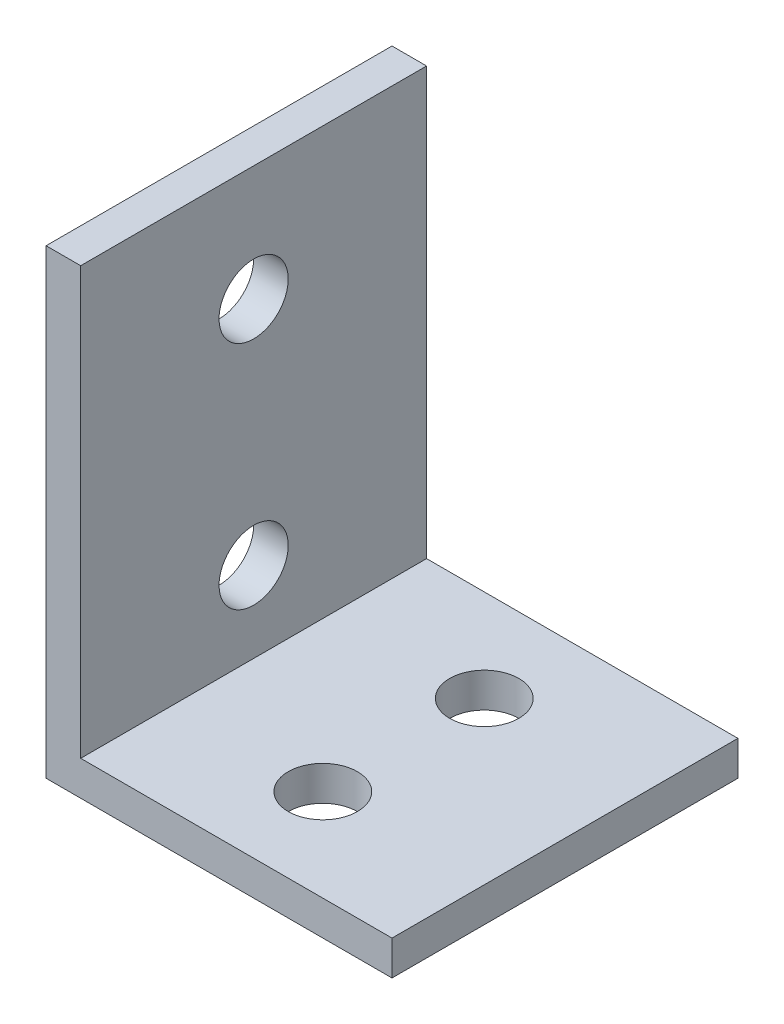
ISO-10303-21;
HEADER;
FILE_DESCRIPTION(('STEP AP214'),'2;1');
FILE_NAME('part.step','',(''),(''),'','','');
FILE_SCHEMA(('AUTOMOTIVE_DESIGN { 1 0 10303 214 1 1 1 1 }'));
ENDSEC;
DATA;
#1=APPLICATION_CONTEXT('core data for automotive mechanical design processes');
#2=APPLICATION_PROTOCOL_DEFINITION('international standard','automotive_design',2000,#1);
#3=PRODUCT_CONTEXT('',#1,'mechanical');
#4=PRODUCT('Part','Part','',(#3));
#5=PRODUCT_RELATED_PRODUCT_CATEGORY('part','',(#4));
#6=PRODUCT_DEFINITION_FORMATION('','',#4);
#7=PRODUCT_DEFINITION_CONTEXT('part definition',#1,'design');
#8=PRODUCT_DEFINITION('design','',#6,#7);
#9=PRODUCT_DEFINITION_SHAPE('','',#8);
#10=(LENGTH_UNIT() NAMED_UNIT(*) SI_UNIT(.MILLI.,.METRE.));
#11=(NAMED_UNIT(*) PLANE_ANGLE_UNIT() SI_UNIT($,.RADIAN.));
#12=(NAMED_UNIT(*) SI_UNIT($,.STERADIAN.) SOLID_ANGLE_UNIT());
#13=UNCERTAINTY_MEASURE_WITH_UNIT(LENGTH_MEASURE(1.E-05),#10,'distance_accuracy_value','');
#14=(GEOMETRIC_REPRESENTATION_CONTEXT(3) GLOBAL_UNCERTAINTY_ASSIGNED_CONTEXT((#13)) GLOBAL_UNIT_ASSIGNED_CONTEXT((#10,
#11,#12)) REPRESENTATION_CONTEXT('',''));
#15=CARTESIAN_POINT('',(0.,0.,0.));
#16=DIRECTION('',(0.,0.,1.));
#17=DIRECTION('',(1.,0.,0.));
#18=AXIS2_PLACEMENT_3D('',#15,#16,#17);
#19=CARTESIAN_POINT('',(-27.0675811166779,0.000842105263170606,15.));
#20=DIRECTION('',(0.,-1.,0.));
#21=DIRECTION('',(0.,0.,-1.));
#22=AXIS2_PLACEMENT_3D('',#19,#20,#21);
#23=PLANE('',#22);
#24=DIRECTION('',(-1.,0.,0.));
#25=VECTOR('',#24,1.);
#26=CARTESIAN_POINT('',(-27.0675811166779,0.000842105263170606,0.));
#27=LINE('',#26,#25);
#28=CARTESIAN_POINT('',(-27.0675811166779,0.000842105263170606,0.));
#29=VERTEX_POINT('',#28);
#30=CARTESIAN_POINT('',(-28.5675811166779,0.000842105263170606,0.));
#31=VERTEX_POINT('',#30);
#32=EDGE_CURVE('E115',#29,#31,#27,.T.);
#33=ORIENTED_EDGE('',*,*,#32,.T.);
#34=DIRECTION('',(0.,0.,-1.));
#35=VECTOR('',#34,1.);
#36=CARTESIAN_POINT('',(-28.5675811166779,0.000842105263170606,15.));
#37=LINE('',#36,#35);
#38=CARTESIAN_POINT('',(-28.5675811166779,0.000842105263170606,15.));
#39=VERTEX_POINT('',#38);
#40=EDGE_CURVE('E11',#39,#31,#37,.T.);
#41=ORIENTED_EDGE('',*,*,#40,.F.);
#42=DIRECTION('',(-1.,0.,0.));
#43=VECTOR('',#42,1.);
#44=CARTESIAN_POINT('',(-27.0675811166779,0.000842105263170606,15.));
#45=LINE('',#44,#43);
#46=CARTESIAN_POINT('',(-27.0675811166779,0.000842105263170606,15.));
#47=VERTEX_POINT('',#46);
#48=EDGE_CURVE('E126',#47,#39,#45,.T.);
#49=ORIENTED_EDGE('',*,*,#48,.F.);
#50=DIRECTION('',(0.,0.,-1.));
#51=VECTOR('',#50,1.);
#52=CARTESIAN_POINT('',(-27.0675811166779,0.000842105263170606,15.));
#53=LINE('',#52,#51);
#54=EDGE_CURVE('E111',#47,#29,#53,.T.);
#55=ORIENTED_EDGE('',*,*,#54,.T.);
#56=EDGE_LOOP('',(#33,#41,#49,#55));
#57=FACE_BOUND('',#56,.T.);
#58=ADVANCED_FACE('F31',(#57),#23,.F.);
#59=CARTESIAN_POINT('',(-28.5675811166779,0.000842105263170606,15.));
#60=DIRECTION('',(1.,0.,0.));
#61=DIRECTION('',(0.,1.,0.));
#62=AXIS2_PLACEMENT_3D('',#59,#60,#61);
#63=PLANE('',#62);
#64=CARTESIAN_POINT('',(-28.5675811166779,-14.9991578947368,7.5));
#65=DIRECTION('',(1.,0.,0.));
#66=DIRECTION('',(0.,1.,0.));
#67=AXIS2_PLACEMENT_3D('',#64,#65,#66);
#68=CIRCLE('',#67,1.5);
#69=CARTESIAN_POINT('',(-28.5675811166779,-13.4991578947368,7.5));
#70=VERTEX_POINT('',#69);
#71=EDGE_CURVE('E248',#70,#70,#68,.T.);
#72=ORIENTED_EDGE('',*,*,#71,.T.);
#73=EDGE_LOOP('',(#72));
#74=FACE_BOUND('',#73,.T.);
#75=CARTESIAN_POINT('',(-28.5675811166779,-4.99915789473683,7.5));
#76=DIRECTION('',(1.,0.,0.));
#77=DIRECTION('',(0.,1.,0.));
#78=AXIS2_PLACEMENT_3D('',#75,#76,#77);
#79=CIRCLE('',#78,1.5);
#80=CARTESIAN_POINT('',(-28.5675811166779,-3.49915789473683,7.5));
#81=VERTEX_POINT('',#80);
#82=EDGE_CURVE('E252',#81,#81,#79,.T.);
#83=ORIENTED_EDGE('',*,*,#82,.T.);
#84=EDGE_LOOP('',(#83));
#85=FACE_BOUND('',#84,.T.);
#86=DIRECTION('',(0.,-1.,0.));
#87=VECTOR('',#86,1.);
#88=CARTESIAN_POINT('',(-28.5675811166779,0.000842105263170606,0.));
#89=LINE('',#88,#87);
#90=CARTESIAN_POINT('',(-28.5675811166779,-19.9991578947368,0.));
#91=VERTEX_POINT('',#90);
#92=EDGE_CURVE('E118',#31,#91,#89,.T.);
#93=ORIENTED_EDGE('',*,*,#92,.T.);
#94=DIRECTION('',(0.,0.,-1.));
#95=VECTOR('',#94,1.);
#96=CARTESIAN_POINT('',(-28.5675811166779,-19.9991578947368,15.));
#97=LINE('',#96,#95);
#98=CARTESIAN_POINT('',(-28.5675811166779,-19.9991578947368,15.));
#99=VERTEX_POINT('',#98);
#100=EDGE_CURVE('E39',#99,#91,#97,.T.);
#101=ORIENTED_EDGE('',*,*,#100,.F.);
#102=DIRECTION('',(0.,-1.,0.));
#103=VECTOR('',#102,1.);
#104=CARTESIAN_POINT('',(-28.5675811166779,0.000842105263170606,15.));
#105=LINE('',#104,#103);
#106=EDGE_CURVE('E84',#39,#99,#105,.T.);
#107=ORIENTED_EDGE('',*,*,#106,.F.);
#108=ORIENTED_EDGE('',*,*,#40,.T.);
#109=EDGE_LOOP('',(#93,#101,#107,#108));
#110=FACE_BOUND('',#109,.T.);
#111=ADVANCED_FACE('F154',(#74,#85,#110),#63,.F.);
#112=CARTESIAN_POINT('',(-28.5675811166779,-19.9991578947368,15.));
#113=DIRECTION('',(0.,1.,0.));
#114=DIRECTION('',(0.,0.,1.));
#115=AXIS2_PLACEMENT_3D('',#112,#113,#114);
#116=PLANE('',#115);
#117=CARTESIAN_POINT('',(-20.5675811166779,-19.9991578947368,11.));
#118=DIRECTION('',(0.,1.,0.));
#119=DIRECTION('',(0.,0.,1.));
#120=AXIS2_PLACEMENT_3D('',#117,#118,#119);
#121=CIRCLE('',#120,1.5);
#122=CARTESIAN_POINT('',(-20.5675811166779,-19.9991578947368,12.5));
#123=VERTEX_POINT('',#122);
#124=EDGE_CURVE('E261',#123,#123,#121,.T.);
#125=ORIENTED_EDGE('',*,*,#124,.T.);
#126=EDGE_LOOP('',(#125));
#127=FACE_BOUND('',#126,.T.);
#128=CARTESIAN_POINT('',(-20.5675811166779,-19.9991578947368,4.));
#129=DIRECTION('',(0.,1.,0.));
#130=DIRECTION('',(0.,0.,1.));
#131=AXIS2_PLACEMENT_3D('',#128,#129,#130);
#132=CIRCLE('',#131,1.5);
#133=CARTESIAN_POINT('',(-20.5675811166779,-19.9991578947368,5.5));
#134=VERTEX_POINT('',#133);
#135=EDGE_CURVE('E119',#134,#134,#132,.T.);
#136=ORIENTED_EDGE('',*,*,#135,.T.);
#137=EDGE_LOOP('',(#136));
#138=FACE_BOUND('',#137,.T.);
#139=DIRECTION('',(1.,0.,0.));
#140=VECTOR('',#139,1.);
#141=CARTESIAN_POINT('',(-28.5675811166779,-19.9991578947368,0.));
#142=LINE('',#141,#140);
#143=CARTESIAN_POINT('',(-13.5675811166779,-19.9991578947368,0.));
#144=VERTEX_POINT('',#143);
#145=EDGE_CURVE('E121',#91,#144,#142,.T.);
#146=ORIENTED_EDGE('',*,*,#145,.T.);
#147=DIRECTION('',(0.,0.,-1.));
#148=VECTOR('',#147,1.);
#149=CARTESIAN_POINT('',(-13.5675811166779,-19.9991578947368,15.));
#150=LINE('',#149,#148);
#151=CARTESIAN_POINT('',(-13.5675811166779,-19.9991578947368,15.));
#152=VERTEX_POINT('',#151);
#153=EDGE_CURVE('E106',#152,#144,#150,.T.);
#154=ORIENTED_EDGE('',*,*,#153,.F.);
#155=DIRECTION('',(1.,0.,0.));
#156=VECTOR('',#155,1.);
#157=CARTESIAN_POINT('',(-28.5675811166779,-19.9991578947368,15.));
#158=LINE('',#157,#156);
#159=EDGE_CURVE('E97',#99,#152,#158,.T.);
#160=ORIENTED_EDGE('',*,*,#159,.F.);
#161=ORIENTED_EDGE('',*,*,#100,.T.);
#162=EDGE_LOOP('',(#146,#154,#160,#161));
#163=FACE_BOUND('',#162,.T.);
#164=ADVANCED_FACE('F132',(#127,#138,#163),#116,.F.);
#165=CARTESIAN_POINT('',(-13.5675811166779,-19.9991578947368,15.));
#166=DIRECTION('',(-1.,0.,0.));
#167=DIRECTION('',(0.,0.,1.));
#168=AXIS2_PLACEMENT_3D('',#165,#166,#167);
#169=PLANE('',#168);
#170=DIRECTION('',(0.,1.,0.));
#171=VECTOR('',#170,1.);
#172=CARTESIAN_POINT('',(-13.5675811166779,-19.9991578947368,0.));
#173=LINE('',#172,#171);
#174=CARTESIAN_POINT('',(-13.5675811166779,-18.4991578947368,0.));
#175=VERTEX_POINT('',#174);
#176=EDGE_CURVE('E105',#144,#175,#173,.T.);
#177=ORIENTED_EDGE('',*,*,#176,.T.);
#178=DIRECTION('',(0.,0.,-1.));
#179=VECTOR('',#178,1.);
#180=CARTESIAN_POINT('',(-13.5675811166779,-18.4991578947368,15.));
#181=LINE('',#180,#179);
#182=CARTESIAN_POINT('',(-13.5675811166779,-18.4991578947368,15.));
#183=VERTEX_POINT('',#182);
#184=EDGE_CURVE('E102',#183,#175,#181,.T.);
#185=ORIENTED_EDGE('',*,*,#184,.F.);
#186=DIRECTION('',(0.,1.,0.));
#187=VECTOR('',#186,1.);
#188=CARTESIAN_POINT('',(-13.5675811166779,-19.9991578947368,15.));
#189=LINE('',#188,#187);
#190=EDGE_CURVE('E91',#152,#183,#189,.T.);
#191=ORIENTED_EDGE('',*,*,#190,.F.);
#192=ORIENTED_EDGE('',*,*,#153,.T.);
#193=EDGE_LOOP('',(#177,#185,#191,#192));
#194=FACE_BOUND('',#193,.T.);
#195=ADVANCED_FACE('F103',(#194),#169,.F.);
#196=CARTESIAN_POINT('',(-13.5675811166779,-18.4991578947368,15.));
#197=DIRECTION('',(0.,-1.,0.));
#198=DIRECTION('',(1.,0.,0.));
#199=AXIS2_PLACEMENT_3D('',#196,#197,#198);
#200=PLANE('',#199);
#201=CARTESIAN_POINT('',(-20.5675811166779,-18.4991578947368,11.));
#202=DIRECTION('',(0.,1.,0.));
#203=DIRECTION('',(-1.,0.,0.));
#204=AXIS2_PLACEMENT_3D('',#201,#202,#203);
#205=CIRCLE('',#204,1.5);
#206=CARTESIAN_POINT('',(-22.0675811166779,-18.4991578947368,11.));
#207=VERTEX_POINT('',#206);
#208=EDGE_CURVE('E258',#207,#207,#205,.T.);
#209=ORIENTED_EDGE('',*,*,#208,.F.);
#210=EDGE_LOOP('',(#209));
#211=FACE_BOUND('',#210,.T.);
#212=CARTESIAN_POINT('',(-20.5675811166779,-18.4991578947368,4.));
#213=DIRECTION('',(0.,1.,0.));
#214=DIRECTION('',(-1.,0.,0.));
#215=AXIS2_PLACEMENT_3D('',#212,#213,#214);
#216=CIRCLE('',#215,1.5);
#217=CARTESIAN_POINT('',(-22.0675811166779,-18.4991578947368,4.));
#218=VERTEX_POINT('',#217);
#219=EDGE_CURVE('E264',#218,#218,#216,.T.);
#220=ORIENTED_EDGE('',*,*,#219,.F.);
#221=EDGE_LOOP('',(#220));
#222=FACE_BOUND('',#221,.T.);
#223=DIRECTION('',(-1.,0.,0.));
#224=VECTOR('',#223,1.);
#225=CARTESIAN_POINT('',(-13.5675811166779,-18.4991578947368,0.));
#226=LINE('',#225,#224);
#227=CARTESIAN_POINT('',(-27.0675811166779,-18.4991578947368,0.));
#228=VERTEX_POINT('',#227);
#229=EDGE_CURVE('E70',#175,#228,#226,.T.);
#230=ORIENTED_EDGE('',*,*,#229,.T.);
#231=DIRECTION('',(0.,0.,-1.));
#232=VECTOR('',#231,1.);
#233=CARTESIAN_POINT('',(-27.0675811166779,-18.4991578947368,15.));
#234=LINE('',#233,#232);
#235=CARTESIAN_POINT('',(-27.0675811166779,-18.4991578947368,15.));
#236=VERTEX_POINT('',#235);
#237=EDGE_CURVE('E107',#236,#228,#234,.T.);
#238=ORIENTED_EDGE('',*,*,#237,.F.);
#239=DIRECTION('',(-1.,0.,0.));
#240=VECTOR('',#239,1.);
#241=CARTESIAN_POINT('',(-13.5675811166779,-18.4991578947368,15.));
#242=LINE('',#241,#240);
#243=EDGE_CURVE('E95',#183,#236,#242,.T.);
#244=ORIENTED_EDGE('',*,*,#243,.F.);
#245=ORIENTED_EDGE('',*,*,#184,.T.);
#246=EDGE_LOOP('',(#230,#238,#244,#245));
#247=FACE_BOUND('',#246,.T.);
#248=ADVANCED_FACE('F109',(#211,#222,#247),#200,.F.);
#249=CARTESIAN_POINT('',(-27.0675811166779,-18.4991578947368,15.));
#250=DIRECTION('',(-1.,0.,0.));
#251=DIRECTION('',(0.,-1.,0.));
#252=AXIS2_PLACEMENT_3D('',#249,#250,#251);
#253=PLANE('',#252);
#254=CARTESIAN_POINT('',(-27.0675811166779,-14.9991578947368,7.5));
#255=DIRECTION('',(1.,0.,0.));
#256=DIRECTION('',(0.,1.,0.));
#257=AXIS2_PLACEMENT_3D('',#254,#255,#256);
#258=CIRCLE('',#257,1.5);
#259=CARTESIAN_POINT('',(-27.0675811166779,-13.4991578947368,7.5));
#260=VERTEX_POINT('',#259);
#261=EDGE_CURVE('E246',#260,#260,#258,.T.);
#262=ORIENTED_EDGE('',*,*,#261,.F.);
#263=EDGE_LOOP('',(#262));
#264=FACE_BOUND('',#263,.T.);
#265=CARTESIAN_POINT('',(-27.0675811166779,-4.99915789473683,7.5));
#266=DIRECTION('',(1.,0.,0.));
#267=DIRECTION('',(0.,1.,0.));
#268=AXIS2_PLACEMENT_3D('',#265,#266,#267);
#269=CIRCLE('',#268,1.5);
#270=CARTESIAN_POINT('',(-27.0675811166779,-3.49915789473683,7.5));
#271=VERTEX_POINT('',#270);
#272=EDGE_CURVE('E249',#271,#271,#269,.T.);
#273=ORIENTED_EDGE('',*,*,#272,.F.);
#274=EDGE_LOOP('',(#273));
#275=FACE_BOUND('',#274,.T.);
#276=DIRECTION('',(0.,1.,0.));
#277=VECTOR('',#276,1.);
#278=CARTESIAN_POINT('',(-27.0675811166779,-18.4991578947368,0.));
#279=LINE('',#278,#277);
#280=EDGE_CURVE('E76',#228,#29,#279,.T.);
#281=ORIENTED_EDGE('',*,*,#280,.T.);
#282=ORIENTED_EDGE('',*,*,#54,.F.);
#283=DIRECTION('',(0.,1.,0.));
#284=VECTOR('',#283,1.);
#285=CARTESIAN_POINT('',(-27.0675811166779,-18.4991578947368,15.));
#286=LINE('',#285,#284);
#287=EDGE_CURVE('E47',#236,#47,#286,.T.);
#288=ORIENTED_EDGE('',*,*,#287,.F.);
#289=ORIENTED_EDGE('',*,*,#237,.T.);
#290=EDGE_LOOP('',(#281,#282,#288,#289));
#291=FACE_BOUND('',#290,.T.);
#292=ADVANCED_FACE('F139',(#264,#275,#291),#253,.F.);
#293=CARTESIAN_POINT('',(-28.5675811166779,0.000842105263170606,15.));
#294=DIRECTION('',(0.,0.,1.));
#295=DIRECTION('',(1.,0.,0.));
#296=AXIS2_PLACEMENT_3D('',#293,#294,#295);
#297=PLANE('',#296);
#298=ORIENTED_EDGE('',*,*,#48,.T.);
#299=ORIENTED_EDGE('',*,*,#106,.T.);
#300=ORIENTED_EDGE('',*,*,#159,.T.);
#301=ORIENTED_EDGE('',*,*,#190,.T.);
#302=ORIENTED_EDGE('',*,*,#243,.T.);
#303=ORIENTED_EDGE('',*,*,#287,.T.);
#304=EDGE_LOOP('',(#298,#299,#300,#301,#302,#303));
#305=FACE_BOUND('',#304,.T.);
#306=ADVANCED_FACE('F93',(#305),#297,.T.);
#307=CARTESIAN_POINT('',(-28.5675811166779,0.000842105263170606,0.));
#308=DIRECTION('',(0.,0.,1.));
#309=DIRECTION('',(1.,0.,0.));
#310=AXIS2_PLACEMENT_3D('',#307,#308,#309);
#311=PLANE('',#310);
#312=ORIENTED_EDGE('',*,*,#32,.F.);
#313=ORIENTED_EDGE('',*,*,#280,.F.);
#314=ORIENTED_EDGE('',*,*,#229,.F.);
#315=ORIENTED_EDGE('',*,*,#176,.F.);
#316=ORIENTED_EDGE('',*,*,#145,.F.);
#317=ORIENTED_EDGE('',*,*,#92,.F.);
#318=EDGE_LOOP('',(#312,#313,#314,#315,#316,#317));
#319=FACE_BOUND('',#318,.T.);
#320=ADVANCED_FACE('F135',(#319),#311,.F.);
#321=CARTESIAN_POINT('',(-20.5675811166779,-33.4991578947368,4.));
#322=DIRECTION('',(0.,1.,0.));
#323=DIRECTION('',(-1.,0.,0.));
#324=AXIS2_PLACEMENT_3D('',#321,#322,#323);
#325=CYLINDRICAL_SURFACE('',#324,1.5);
#326=ORIENTED_EDGE('',*,*,#219,.T.);
#327=EDGE_LOOP('',(#326));
#328=FACE_BOUND('',#327,.T.);
#329=ORIENTED_EDGE('',*,*,#135,.F.);
#330=EDGE_LOOP('',(#329));
#331=FACE_BOUND('',#330,.T.);
#332=ADVANCED_FACE('F186',(#328,#331),#325,.F.);
#333=CARTESIAN_POINT('',(-20.5675811166779,-33.4991578947368,11.));
#334=DIRECTION('',(0.,1.,0.));
#335=DIRECTION('',(-1.,0.,0.));
#336=AXIS2_PLACEMENT_3D('',#333,#334,#335);
#337=CYLINDRICAL_SURFACE('',#336,1.5);
#338=ORIENTED_EDGE('',*,*,#208,.T.);
#339=EDGE_LOOP('',(#338));
#340=FACE_BOUND('',#339,.T.);
#341=ORIENTED_EDGE('',*,*,#124,.F.);
#342=EDGE_LOOP('',(#341));
#343=FACE_BOUND('',#342,.T.);
#344=ADVANCED_FACE('F191',(#340,#343),#337,.F.);
#345=CARTESIAN_POINT('',(-42.0675811166779,-4.99915789473683,7.5));
#346=DIRECTION('',(1.,0.,0.));
#347=DIRECTION('',(0.,1.,0.));
#348=AXIS2_PLACEMENT_3D('',#345,#346,#347);
#349=CYLINDRICAL_SURFACE('',#348,1.5);
#350=ORIENTED_EDGE('',*,*,#272,.T.);
#351=EDGE_LOOP('',(#350));
#352=FACE_BOUND('',#351,.T.);
#353=ORIENTED_EDGE('',*,*,#82,.F.);
#354=EDGE_LOOP('',(#353));
#355=FACE_BOUND('',#354,.T.);
#356=ADVANCED_FACE('F202',(#352,#355),#349,.F.);
#357=CARTESIAN_POINT('',(-42.0675811166779,-14.9991578947368,7.5));
#358=DIRECTION('',(1.,0.,0.));
#359=DIRECTION('',(0.,1.,0.));
#360=AXIS2_PLACEMENT_3D('',#357,#358,#359);
#361=CYLINDRICAL_SURFACE('',#360,1.5);
#362=ORIENTED_EDGE('',*,*,#261,.T.);
#363=EDGE_LOOP('',(#362));
#364=FACE_BOUND('',#363,.T.);
#365=ORIENTED_EDGE('',*,*,#71,.F.);
#366=EDGE_LOOP('',(#365));
#367=FACE_BOUND('',#366,.T.);
#368=ADVANCED_FACE('F222',(#364,#367),#361,.F.);
#369=CLOSED_SHELL('',(#58,#111,#164,#195,#248,#292,#306,#320,#332,#344,#356,#368));
#370=MANIFOLD_SOLID_BREP('B2',#369);
#371=ADVANCED_BREP_SHAPE_REPRESENTATION('',(#18,#370),#14);
#372=SHAPE_DEFINITION_REPRESENTATION(#9,#371);
ENDSEC;
END-ISO-10303-21;
